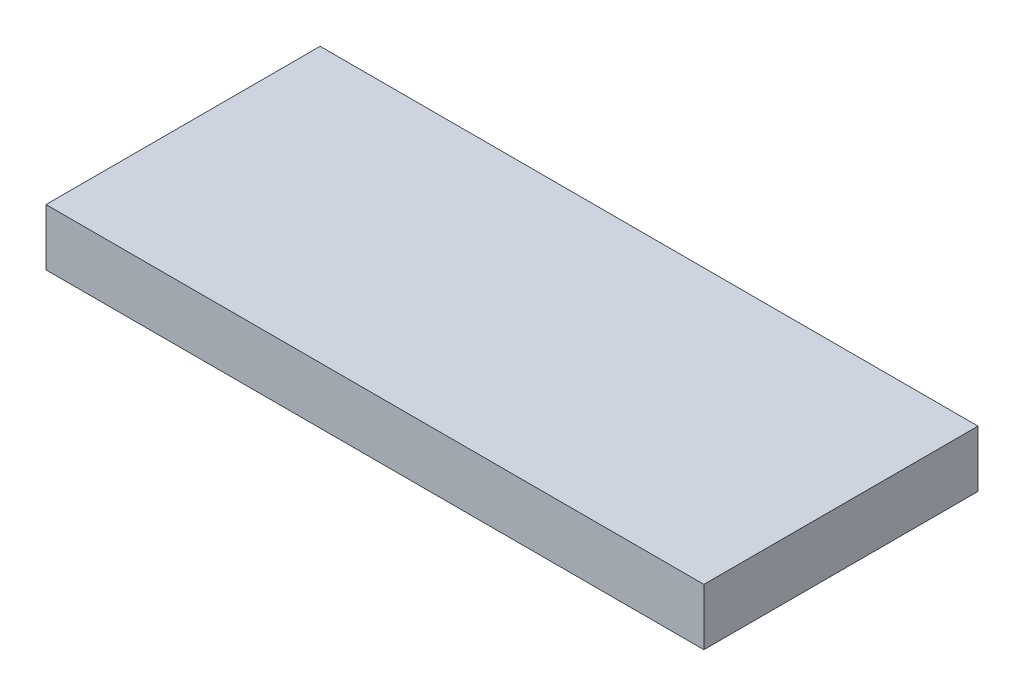
ISO-10303-21;
HEADER;
FILE_DESCRIPTION(('STEP AP214'),'2;1');
FILE_NAME('part.step','',(''),(''),'','','');
FILE_SCHEMA(('AUTOMOTIVE_DESIGN { 1 0 10303 214 1 1 1 1 }'));
ENDSEC;
DATA;
#1=APPLICATION_CONTEXT('core data for automotive mechanical design processes');
#2=APPLICATION_PROTOCOL_DEFINITION('international standard','automotive_design',2000,#1);
#3=PRODUCT_CONTEXT('',#1,'mechanical');
#4=PRODUCT('Part','Part','',(#3));
#5=PRODUCT_RELATED_PRODUCT_CATEGORY('part','',(#4));
#6=PRODUCT_DEFINITION_FORMATION('','',#4);
#7=PRODUCT_DEFINITION_CONTEXT('part definition',#1,'design');
#8=PRODUCT_DEFINITION('design','',#6,#7);
#9=PRODUCT_DEFINITION_SHAPE('','',#8);
#10=(LENGTH_UNIT() NAMED_UNIT(*) SI_UNIT(.MILLI.,.METRE.));
#11=(NAMED_UNIT(*) PLANE_ANGLE_UNIT() SI_UNIT($,.RADIAN.));
#12=(NAMED_UNIT(*) SI_UNIT($,.STERADIAN.) SOLID_ANGLE_UNIT());
#13=UNCERTAINTY_MEASURE_WITH_UNIT(LENGTH_MEASURE(1.E-05),#10,'distance_accuracy_value','');
#14=(GEOMETRIC_REPRESENTATION_CONTEXT(3) GLOBAL_UNCERTAINTY_ASSIGNED_CONTEXT((#13)) GLOBAL_UNIT_ASSIGNED_CONTEXT((#10,
#11,#12)) REPRESENTATION_CONTEXT('',''));
#15=CARTESIAN_POINT('',(0.,0.,0.));
#16=DIRECTION('',(0.,0.,1.));
#17=DIRECTION('',(1.,0.,0.));
#18=AXIS2_PLACEMENT_3D('',#15,#16,#17);
#19=CARTESIAN_POINT('',(186.,32.,77.5));
#20=DIRECTION('',(-1.,0.,0.));
#21=DIRECTION('',(0.,0.,1.));
#22=AXIS2_PLACEMENT_3D('',#19,#20,#21);
#23=PLANE('',#22);
#24=DIRECTION('',(0.,0.,-1.));
#25=VECTOR('',#24,1.);
#26=CARTESIAN_POINT('',(186.,0.,77.5));
#27=LINE('',#26,#25);
#28=CARTESIAN_POINT('',(186.,0.,77.5));
#29=VERTEX_POINT('',#28);
#30=CARTESIAN_POINT('',(186.,0.,-77.5));
#31=VERTEX_POINT('',#30);
#32=EDGE_CURVE('E96',#29,#31,#27,.T.);
#33=ORIENTED_EDGE('',*,*,#32,.T.);
#34=DIRECTION('',(0.,-1.,0.));
#35=VECTOR('',#34,1.);
#36=CARTESIAN_POINT('',(186.,32.,-77.5));
#37=LINE('',#36,#35);
#38=CARTESIAN_POINT('',(186.,32.,-77.5));
#39=VERTEX_POINT('',#38);
#40=EDGE_CURVE('E11',#39,#31,#37,.T.);
#41=ORIENTED_EDGE('',*,*,#40,.F.);
#42=DIRECTION('',(0.,0.,-1.));
#43=VECTOR('',#42,1.);
#44=CARTESIAN_POINT('',(186.,32.,77.5));
#45=LINE('',#44,#43);
#46=CARTESIAN_POINT('',(186.,32.,77.5));
#47=VERTEX_POINT('',#46);
#48=EDGE_CURVE('E84',#47,#39,#45,.T.);
#49=ORIENTED_EDGE('',*,*,#48,.F.);
#50=DIRECTION('',(0.,-1.,0.));
#51=VECTOR('',#50,1.);
#52=CARTESIAN_POINT('',(186.,32.,77.5));
#53=LINE('',#52,#51);
#54=EDGE_CURVE('E92',#47,#29,#53,.T.);
#55=ORIENTED_EDGE('',*,*,#54,.T.);
#56=EDGE_LOOP('',(#33,#41,#49,#55));
#57=FACE_BOUND('',#56,.T.);
#58=ADVANCED_FACE('F33',(#57),#23,.F.);
#59=CARTESIAN_POINT('',(-186.,32.,-77.5));
#60=DIRECTION('',(0.,0.,1.));
#61=DIRECTION('',(1.,0.,0.));
#62=AXIS2_PLACEMENT_3D('',#59,#60,#61);
#63=PLANE('',#62);
#64=DIRECTION('',(-1.,0.,0.));
#65=VECTOR('',#64,1.);
#66=CARTESIAN_POINT('',(-186.,0.,-77.5));
#67=LINE('',#66,#65);
#68=CARTESIAN_POINT('',(-186.,0.,-77.5));
#69=VERTEX_POINT('',#68);
#70=EDGE_CURVE('E88',#31,#69,#67,.T.);
#71=ORIENTED_EDGE('',*,*,#70,.T.);
#72=DIRECTION('',(0.,-1.,0.));
#73=VECTOR('',#72,1.);
#74=CARTESIAN_POINT('',(-186.,32.,-77.5));
#75=LINE('',#74,#73);
#76=CARTESIAN_POINT('',(-186.,32.,-77.5));
#77=VERTEX_POINT('',#76);
#78=EDGE_CURVE('E41',#77,#69,#75,.T.);
#79=ORIENTED_EDGE('',*,*,#78,.F.);
#80=DIRECTION('',(-1.,0.,0.));
#81=VECTOR('',#80,1.);
#82=CARTESIAN_POINT('',(-186.,32.,-77.5));
#83=LINE('',#82,#81);
#84=EDGE_CURVE('E79',#39,#77,#83,.T.);
#85=ORIENTED_EDGE('',*,*,#84,.F.);
#86=ORIENTED_EDGE('',*,*,#40,.T.);
#87=EDGE_LOOP('',(#71,#79,#85,#86));
#88=FACE_BOUND('',#87,.T.);
#89=ADVANCED_FACE('F87',(#88),#63,.F.);
#90=CARTESIAN_POINT('',(-186.,32.,77.5));
#91=DIRECTION('',(1.,0.,0.));
#92=DIRECTION('',(0.,0.,-1.));
#93=AXIS2_PLACEMENT_3D('',#90,#91,#92);
#94=PLANE('',#93);
#95=DIRECTION('',(0.,0.,1.));
#96=VECTOR('',#95,1.);
#97=CARTESIAN_POINT('',(-186.,0.,77.5));
#98=LINE('',#97,#96);
#99=CARTESIAN_POINT('',(-186.,0.,77.5));
#100=VERTEX_POINT('',#99);
#101=EDGE_CURVE('E66',#69,#100,#98,.T.);
#102=ORIENTED_EDGE('',*,*,#101,.T.);
#103=DIRECTION('',(0.,-1.,0.));
#104=VECTOR('',#103,1.);
#105=CARTESIAN_POINT('',(-186.,32.,77.5));
#106=LINE('',#105,#104);
#107=CARTESIAN_POINT('',(-186.,32.,77.5));
#108=VERTEX_POINT('',#107);
#109=EDGE_CURVE('E89',#108,#100,#106,.T.);
#110=ORIENTED_EDGE('',*,*,#109,.F.);
#111=DIRECTION('',(0.,0.,1.));
#112=VECTOR('',#111,1.);
#113=CARTESIAN_POINT('',(-186.,32.,77.5));
#114=LINE('',#113,#112);
#115=EDGE_CURVE('E82',#77,#108,#114,.T.);
#116=ORIENTED_EDGE('',*,*,#115,.F.);
#117=ORIENTED_EDGE('',*,*,#78,.T.);
#118=EDGE_LOOP('',(#102,#110,#116,#117));
#119=FACE_BOUND('',#118,.T.);
#120=ADVANCED_FACE('F90',(#119),#94,.F.);
#121=CARTESIAN_POINT('',(-186.,32.,77.5));
#122=DIRECTION('',(0.,0.,-1.));
#123=DIRECTION('',(-1.,0.,0.));
#124=AXIS2_PLACEMENT_3D('',#121,#122,#123);
#125=PLANE('',#124);
#126=DIRECTION('',(1.,0.,0.));
#127=VECTOR('',#126,1.);
#128=CARTESIAN_POINT('',(-186.,0.,77.5));
#129=LINE('',#128,#127);
#130=EDGE_CURVE('E72',#100,#29,#129,.T.);
#131=ORIENTED_EDGE('',*,*,#130,.T.);
#132=ORIENTED_EDGE('',*,*,#54,.F.);
#133=DIRECTION('',(1.,0.,0.));
#134=VECTOR('',#133,1.);
#135=CARTESIAN_POINT('',(-186.,32.,77.5));
#136=LINE('',#135,#134);
#137=EDGE_CURVE('E49',#108,#47,#136,.T.);
#138=ORIENTED_EDGE('',*,*,#137,.F.);
#139=ORIENTED_EDGE('',*,*,#109,.T.);
#140=EDGE_LOOP('',(#131,#132,#138,#139));
#141=FACE_BOUND('',#140,.T.);
#142=ADVANCED_FACE('F103',(#141),#125,.F.);
#143=CARTESIAN_POINT('',(0.,32.,0.));
#144=DIRECTION('',(0.,-1.,0.));
#145=DIRECTION('',(0.,0.,-1.));
#146=AXIS2_PLACEMENT_3D('',#143,#144,#145);
#147=PLANE('',#146);
#148=ORIENTED_EDGE('',*,*,#48,.T.);
#149=ORIENTED_EDGE('',*,*,#84,.T.);
#150=ORIENTED_EDGE('',*,*,#115,.T.);
#151=ORIENTED_EDGE('',*,*,#137,.T.);
#152=EDGE_LOOP('',(#148,#149,#150,#151));
#153=FACE_BOUND('',#152,.T.);
#154=ADVANCED_FACE('F80',(#153),#147,.F.);
#155=CARTESIAN_POINT('',(0.,0.,0.));
#156=DIRECTION('',(0.,-1.,0.));
#157=DIRECTION('',(0.,0.,-1.));
#158=AXIS2_PLACEMENT_3D('',#155,#156,#157);
#159=PLANE('',#158);
#160=ORIENTED_EDGE('',*,*,#32,.F.);
#161=ORIENTED_EDGE('',*,*,#130,.F.);
#162=ORIENTED_EDGE('',*,*,#101,.F.);
#163=ORIENTED_EDGE('',*,*,#70,.F.);
#164=EDGE_LOOP('',(#160,#161,#162,#163));
#165=FACE_BOUND('',#164,.T.);
#166=ADVANCED_FACE('F106',(#165),#159,.T.);
#167=CLOSED_SHELL('',(#58,#89,#120,#142,#154,#166));
#168=MANIFOLD_SOLID_BREP('B2',#167);
#169=ADVANCED_BREP_SHAPE_REPRESENTATION('',(#18,#168),#14);
#170=SHAPE_DEFINITION_REPRESENTATION(#9,#169);
ENDSEC;
END-ISO-10303-21;
